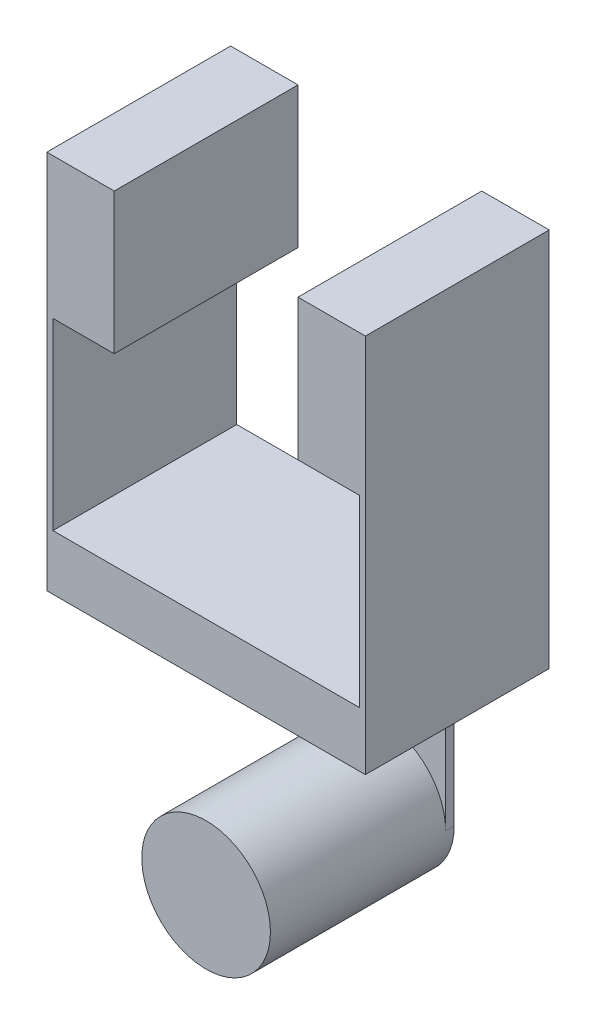
ISO-10303-21;
HEADER;
FILE_DESCRIPTION(('STEP AP214'),'2;1');
FILE_NAME('part.step','',(''),(''),'','','');
FILE_SCHEMA(('AUTOMOTIVE_DESIGN { 1 0 10303 214 1 1 1 1 }'));
ENDSEC;
DATA;
#1=APPLICATION_CONTEXT('core data for automotive mechanical design processes');
#2=APPLICATION_PROTOCOL_DEFINITION('international standard','automotive_design',2000,#1);
#3=PRODUCT_CONTEXT('',#1,'mechanical');
#4=PRODUCT('Part','Part','',(#3));
#5=PRODUCT_RELATED_PRODUCT_CATEGORY('part','',(#4));
#6=PRODUCT_DEFINITION_FORMATION('','',#4);
#7=PRODUCT_DEFINITION_CONTEXT('part definition',#1,'design');
#8=PRODUCT_DEFINITION('design','',#6,#7);
#9=PRODUCT_DEFINITION_SHAPE('','',#8);
#10=(LENGTH_UNIT() NAMED_UNIT(*) SI_UNIT(.MILLI.,.METRE.));
#11=(NAMED_UNIT(*) PLANE_ANGLE_UNIT() SI_UNIT($,.RADIAN.));
#12=(NAMED_UNIT(*) SI_UNIT($,.STERADIAN.) SOLID_ANGLE_UNIT());
#13=UNCERTAINTY_MEASURE_WITH_UNIT(LENGTH_MEASURE(1.E-05),#10,'distance_accuracy_value','');
#14=(GEOMETRIC_REPRESENTATION_CONTEXT(3) GLOBAL_UNCERTAINTY_ASSIGNED_CONTEXT((#13)) GLOBAL_UNIT_ASSIGNED_CONTEXT((#10,
#11,#12)) REPRESENTATION_CONTEXT('',''));
#15=CARTESIAN_POINT('',(0.,0.,0.));
#16=DIRECTION('',(0.,0.,1.));
#17=DIRECTION('',(1.,0.,0.));
#18=AXIS2_PLACEMENT_3D('',#15,#16,#17);
#19=CARTESIAN_POINT('',(0.,0.,-38.1));
#20=DIRECTION('',(0.,0.,1.));
#21=DIRECTION('',(1.,0.,0.));
#22=AXIS2_PLACEMENT_3D('',#19,#20,#21);
#23=CYLINDRICAL_SURFACE('',#22,13.335);
#24=DIRECTION('',(0.,0.,-1.));
#25=VECTOR('',#24,1.);
#26=CARTESIAN_POINT('',(-13.335,0.,-36.322));
#27=LINE('',#26,#25);
#28=CARTESIAN_POINT('',(-13.335,0.,-36.322));
#29=VERTEX_POINT('',#28);
#30=CARTESIAN_POINT('',(-13.335,0.,-38.1));
#31=VERTEX_POINT('',#30);
#32=EDGE_CURVE('E318',#29,#31,#27,.T.);
#33=ORIENTED_EDGE('',*,*,#32,.T.);
#34=CARTESIAN_POINT('',(0.,0.,-38.1));
#35=DIRECTION('',(0.,0.,1.));
#36=DIRECTION('',(1.,0.,0.));
#37=AXIS2_PLACEMENT_3D('',#34,#35,#36);
#38=CIRCLE('',#37,13.335);
#39=CARTESIAN_POINT('',(13.335,0.,-38.1));
#40=VERTEX_POINT('',#39);
#41=EDGE_CURVE('E52',#31,#40,#38,.T.);
#42=ORIENTED_EDGE('',*,*,#41,.T.);
#43=DIRECTION('',(0.,0.,-1.));
#44=VECTOR('',#43,1.);
#45=CARTESIAN_POINT('',(13.335,0.,-36.322));
#46=LINE('',#45,#44);
#47=CARTESIAN_POINT('',(13.335,0.,-36.322));
#48=VERTEX_POINT('',#47);
#49=EDGE_CURVE('E323',#48,#40,#46,.T.);
#50=ORIENTED_EDGE('',*,*,#49,.F.);
#51=CARTESIAN_POINT('',(0.,0.,-36.322));
#52=DIRECTION('',(0.,0.,-1.));
#53=DIRECTION('',(-1.,0.,0.));
#54=AXIS2_PLACEMENT_3D('',#51,#52,#53);
#55=CIRCLE('',#54,13.335);
#56=EDGE_CURVE('E11',#48,#29,#55,.F.);
#57=ORIENTED_EDGE('',*,*,#56,.T.);
#58=EDGE_LOOP('',(#33,#42,#50,#57));
#59=FACE_BOUND('',#58,.T.);
#60=CARTESIAN_POINT('',(0.,0.,0.));
#61=DIRECTION('',(0.,0.,1.));
#62=DIRECTION('',(1.,0.,0.));
#63=AXIS2_PLACEMENT_3D('',#60,#61,#62);
#64=CIRCLE('',#63,13.335);
#65=CARTESIAN_POINT('',(13.335,0.,0.));
#66=VERTEX_POINT('',#65);
#67=EDGE_CURVE('E325',#66,#66,#64,.T.);
#68=ORIENTED_EDGE('',*,*,#67,.F.);
#69=EDGE_LOOP('',(#68));
#70=FACE_BOUND('',#69,.T.);
#71=ADVANCED_FACE('F44',(#59,#70),#23,.T.);
#72=CARTESIAN_POINT('',(0.,0.,-38.1));
#73=DIRECTION('',(0.,0.,1.));
#74=DIRECTION('',(1.,0.,0.));
#75=AXIS2_PLACEMENT_3D('',#72,#73,#74);
#76=PLANE('',#75);
#77=ORIENTED_EDGE('',*,*,#41,.F.);
#78=DIRECTION('',(0.,1.,0.));
#79=VECTOR('',#78,1.);
#80=CARTESIAN_POINT('',(-13.335,0.,-38.1));
#81=LINE('',#80,#79);
#82=CARTESIAN_POINT('',(-13.335,38.1,-38.1));
#83=VERTEX_POINT('',#82);
#84=EDGE_CURVE('E299',#31,#83,#81,.T.);
#85=ORIENTED_EDGE('',*,*,#84,.T.);
#86=DIRECTION('',(-1.,0.,0.));
#87=VECTOR('',#86,1.);
#88=CARTESIAN_POINT('',(0.,38.1,-38.1));
#89=LINE('',#88,#87);
#90=CARTESIAN_POINT('',(-33.02,38.1,-38.1));
#91=VERTEX_POINT('',#90);
#92=EDGE_CURVE('E260',#83,#91,#89,.T.);
#93=ORIENTED_EDGE('',*,*,#92,.T.);
#94=DIRECTION('',(0.,-1.,0.));
#95=VECTOR('',#94,1.);
#96=CARTESIAN_POINT('',(-33.02,49.53,-38.1));
#97=LINE('',#96,#95);
#98=CARTESIAN_POINT('',(-33.02,116.84,-38.1));
#99=VERTEX_POINT('',#98);
#100=EDGE_CURVE('E291',#99,#91,#97,.T.);
#101=ORIENTED_EDGE('',*,*,#100,.F.);
#102=DIRECTION('',(-1.,0.,0.));
#103=VECTOR('',#102,1.);
#104=CARTESIAN_POINT('',(-33.02,116.84,-38.1));
#105=LINE('',#104,#103);
#106=CARTESIAN_POINT('',(-19.05,116.84,-38.1));
#107=VERTEX_POINT('',#106);
#108=EDGE_CURVE('E219',#107,#99,#105,.T.);
#109=ORIENTED_EDGE('',*,*,#108,.F.);
#110=DIRECTION('',(0.,-1.,0.));
#111=VECTOR('',#110,1.);
#112=CARTESIAN_POINT('',(-19.05,116.84,-38.1));
#113=LINE('',#112,#111);
#114=CARTESIAN_POINT('',(-19.05,87.63,-38.1));
#115=VERTEX_POINT('',#114);
#116=EDGE_CURVE('E216',#107,#115,#113,.T.);
#117=ORIENTED_EDGE('',*,*,#116,.T.);
#118=DIRECTION('',(-1.,0.,0.));
#119=VECTOR('',#118,1.);
#120=CARTESIAN_POINT('',(-33.02,87.63,-38.1));
#121=LINE('',#120,#119);
#122=CARTESIAN_POINT('',(-31.75,87.63,-38.1));
#123=VERTEX_POINT('',#122);
#124=EDGE_CURVE('E222',#115,#123,#121,.T.);
#125=ORIENTED_EDGE('',*,*,#124,.T.);
#126=DIRECTION('',(0.,-1.,0.));
#127=VECTOR('',#126,1.);
#128=CARTESIAN_POINT('',(-31.75,87.63,-38.1));
#129=LINE('',#128,#127);
#130=CARTESIAN_POINT('',(-31.75,49.53,-38.1));
#131=VERTEX_POINT('',#130);
#132=EDGE_CURVE('E261',#123,#131,#129,.T.);
#133=ORIENTED_EDGE('',*,*,#132,.T.);
#134=DIRECTION('',(-1.,0.,0.));
#135=VECTOR('',#134,1.);
#136=CARTESIAN_POINT('',(33.02,49.53,-38.1));
#137=LINE('',#136,#135);
#138=CARTESIAN_POINT('',(31.75,49.53,-38.1));
#139=VERTEX_POINT('',#138);
#140=EDGE_CURVE('E271',#139,#131,#137,.T.);
#141=ORIENTED_EDGE('',*,*,#140,.F.);
#142=DIRECTION('',(0.,-1.,0.));
#143=VECTOR('',#142,1.);
#144=CARTESIAN_POINT('',(31.75,87.63,-38.1));
#145=LINE('',#144,#143);
#146=CARTESIAN_POINT('',(31.75,87.63,-38.1));
#147=VERTEX_POINT('',#146);
#148=EDGE_CURVE('E251',#147,#139,#145,.T.);
#149=ORIENTED_EDGE('',*,*,#148,.F.);
#150=DIRECTION('',(-1.,0.,0.));
#151=VECTOR('',#150,1.);
#152=CARTESIAN_POINT('',(33.02,87.63,-38.1));
#153=LINE('',#152,#151);
#154=CARTESIAN_POINT('',(19.05,87.63,-38.1));
#155=VERTEX_POINT('',#154);
#156=EDGE_CURVE('E199',#147,#155,#153,.T.);
#157=ORIENTED_EDGE('',*,*,#156,.T.);
#158=DIRECTION('',(0.,-1.,0.));
#159=VECTOR('',#158,1.);
#160=CARTESIAN_POINT('',(19.05,116.84,-38.1));
#161=LINE('',#160,#159);
#162=CARTESIAN_POINT('',(19.05,116.84,-38.1));
#163=VERTEX_POINT('',#162);
#164=EDGE_CURVE('E179',#163,#155,#161,.T.);
#165=ORIENTED_EDGE('',*,*,#164,.F.);
#166=DIRECTION('',(-1.,0.,0.));
#167=VECTOR('',#166,1.);
#168=CARTESIAN_POINT('',(33.02,116.84,-38.1));
#169=LINE('',#168,#167);
#170=CARTESIAN_POINT('',(33.02,116.84,-38.1));
#171=VERTEX_POINT('',#170);
#172=EDGE_CURVE('E172',#171,#163,#169,.T.);
#173=ORIENTED_EDGE('',*,*,#172,.F.);
#174=DIRECTION('',(0.,-1.,0.));
#175=VECTOR('',#174,1.);
#176=CARTESIAN_POINT('',(33.02,49.53,-38.1));
#177=LINE('',#176,#175);
#178=CARTESIAN_POINT('',(33.02,38.1,-38.1));
#179=VERTEX_POINT('',#178);
#180=EDGE_CURVE('E158',#171,#179,#177,.T.);
#181=ORIENTED_EDGE('',*,*,#180,.T.);
#182=CARTESIAN_POINT('',(13.335,38.1,-38.1));
#183=VERTEX_POINT('',#182);
#184=EDGE_CURVE('E277',#179,#183,#89,.T.);
#185=ORIENTED_EDGE('',*,*,#184,.T.);
#186=DIRECTION('',(0.,-1.,0.));
#187=VECTOR('',#186,1.);
#188=CARTESIAN_POINT('',(13.335,38.1,-38.1));
#189=LINE('',#188,#187);
#190=EDGE_CURVE('E305',#183,#40,#189,.T.);
#191=ORIENTED_EDGE('',*,*,#190,.T.);
#192=EDGE_LOOP('',(#77,#85,#93,#101,#109,#117,#125,#133,#141,#149,#157,#165,#173,#181,#185,#191));
#193=FACE_BOUND('',#192,.T.);
#194=ADVANCED_FACE('F171',(#193),#76,.F.);
#195=CARTESIAN_POINT('',(0.,0.,0.));
#196=DIRECTION('',(0.,0.,1.));
#197=DIRECTION('',(1.,0.,0.));
#198=AXIS2_PLACEMENT_3D('',#195,#196,#197);
#199=PLANE('',#198);
#200=ORIENTED_EDGE('',*,*,#67,.T.);
#201=EDGE_LOOP('',(#200));
#202=FACE_BOUND('',#201,.T.);
#203=ADVANCED_FACE('F337',(#202),#199,.T.);
#204=CARTESIAN_POINT('',(-13.335,0.,-36.322));
#205=DIRECTION('',(-1.,0.,0.));
#206=DIRECTION('',(0.,0.,1.));
#207=AXIS2_PLACEMENT_3D('',#204,#205,#206);
#208=PLANE('',#207);
#209=ORIENTED_EDGE('',*,*,#84,.F.);
#210=ORIENTED_EDGE('',*,*,#32,.F.);
#211=DIRECTION('',(0.,1.,0.));
#212=VECTOR('',#211,1.);
#213=CARTESIAN_POINT('',(-13.335,0.,-36.322));
#214=LINE('',#213,#212);
#215=CARTESIAN_POINT('',(-13.335,38.1,-36.322));
#216=VERTEX_POINT('',#215);
#217=EDGE_CURVE('E297',#29,#216,#214,.T.);
#218=ORIENTED_EDGE('',*,*,#217,.T.);
#219=DIRECTION('',(0.,0.,-1.));
#220=VECTOR('',#219,1.);
#221=CARTESIAN_POINT('',(-13.335,38.1,-36.322));
#222=LINE('',#221,#220);
#223=EDGE_CURVE('E313',#216,#83,#222,.T.);
#224=ORIENTED_EDGE('',*,*,#223,.T.);
#225=EDGE_LOOP('',(#209,#210,#218,#224));
#226=FACE_BOUND('',#225,.T.);
#227=ADVANCED_FACE('F358',(#226),#208,.T.);
#228=CARTESIAN_POINT('',(13.335,38.1,-36.322));
#229=DIRECTION('',(1.,0.,0.));
#230=DIRECTION('',(0.,0.,-1.));
#231=AXIS2_PLACEMENT_3D('',#228,#229,#230);
#232=PLANE('',#231);
#233=ORIENTED_EDGE('',*,*,#190,.F.);
#234=DIRECTION('',(0.,0.,-1.));
#235=VECTOR('',#234,1.);
#236=CARTESIAN_POINT('',(13.335,38.1,-36.322));
#237=LINE('',#236,#235);
#238=CARTESIAN_POINT('',(13.335,38.1,-36.322));
#239=VERTEX_POINT('',#238);
#240=EDGE_CURVE('E326',#239,#183,#237,.T.);
#241=ORIENTED_EDGE('',*,*,#240,.F.);
#242=DIRECTION('',(0.,-1.,0.));
#243=VECTOR('',#242,1.);
#244=CARTESIAN_POINT('',(13.335,38.1,-36.322));
#245=LINE('',#244,#243);
#246=EDGE_CURVE('E307',#239,#48,#245,.T.);
#247=ORIENTED_EDGE('',*,*,#246,.T.);
#248=ORIENTED_EDGE('',*,*,#49,.T.);
#249=EDGE_LOOP('',(#233,#241,#247,#248));
#250=FACE_BOUND('',#249,.T.);
#251=ADVANCED_FACE('F352',(#250),#232,.T.);
#252=CARTESIAN_POINT('',(0.,0.,-36.322));
#253=DIRECTION('',(0.,0.,-1.));
#254=DIRECTION('',(-1.,0.,0.));
#255=AXIS2_PLACEMENT_3D('',#252,#253,#254);
#256=PLANE('',#255);
#257=ORIENTED_EDGE('',*,*,#56,.F.);
#258=ORIENTED_EDGE('',*,*,#246,.F.);
#259=DIRECTION('',(1.,0.,0.));
#260=VECTOR('',#259,1.);
#261=CARTESIAN_POINT('',(-13.335,38.1,-36.322));
#262=LINE('',#261,#260);
#263=EDGE_CURVE('E304',#216,#239,#262,.T.);
#264=ORIENTED_EDGE('',*,*,#263,.F.);
#265=ORIENTED_EDGE('',*,*,#217,.F.);
#266=EDGE_LOOP('',(#257,#258,#264,#265));
#267=FACE_BOUND('',#266,.T.);
#268=ADVANCED_FACE('F356',(#267),#256,.F.);
#269=CARTESIAN_POINT('',(-33.02,49.53,-38.1));
#270=DIRECTION('',(1.,0.,0.));
#271=DIRECTION('',(0.,0.,-1.));
#272=AXIS2_PLACEMENT_3D('',#269,#270,#271);
#273=PLANE('',#272);
#274=DIRECTION('',(0.,0.,1.));
#275=VECTOR('',#274,1.);
#276=CARTESIAN_POINT('',(-33.02,38.1,-38.1));
#277=LINE('',#276,#275);
#278=CARTESIAN_POINT('',(-33.02,38.1,0.));
#279=VERTEX_POINT('',#278);
#280=EDGE_CURVE('E276',#91,#279,#277,.T.);
#281=ORIENTED_EDGE('',*,*,#280,.T.);
#282=DIRECTION('',(0.,-1.,0.));
#283=VECTOR('',#282,1.);
#284=CARTESIAN_POINT('',(-33.02,49.53,0.));
#285=LINE('',#284,#283);
#286=CARTESIAN_POINT('',(-33.02,116.84,0.));
#287=VERTEX_POINT('',#286);
#288=EDGE_CURVE('E286',#287,#279,#285,.T.);
#289=ORIENTED_EDGE('',*,*,#288,.F.);
#290=DIRECTION('',(0.,0.,1.));
#291=VECTOR('',#290,1.);
#292=CARTESIAN_POINT('',(-33.02,116.84,0.));
#293=LINE('',#292,#291);
#294=EDGE_CURVE('E228',#99,#287,#293,.T.);
#295=ORIENTED_EDGE('',*,*,#294,.F.);
#296=ORIENTED_EDGE('',*,*,#100,.T.);
#297=EDGE_LOOP('',(#281,#289,#295,#296));
#298=FACE_BOUND('',#297,.T.);
#299=ADVANCED_FACE('F369',(#298),#273,.F.);
#300=CARTESIAN_POINT('',(-33.02,49.53,0.));
#301=DIRECTION('',(0.,0.,-1.));
#302=DIRECTION('',(-1.,0.,0.));
#303=AXIS2_PLACEMENT_3D('',#300,#301,#302);
#304=PLANE('',#303);
#305=DIRECTION('',(1.,0.,0.));
#306=VECTOR('',#305,1.);
#307=CARTESIAN_POINT('',(-33.02,38.1,0.));
#308=LINE('',#307,#306);
#309=CARTESIAN_POINT('',(33.02,38.1,0.));
#310=VERTEX_POINT('',#309);
#311=EDGE_CURVE('E284',#279,#310,#308,.T.);
#312=ORIENTED_EDGE('',*,*,#311,.T.);
#313=DIRECTION('',(0.,-1.,0.));
#314=VECTOR('',#313,1.);
#315=CARTESIAN_POINT('',(33.02,49.53,0.));
#316=LINE('',#315,#314);
#317=CARTESIAN_POINT('',(33.02,116.84,0.));
#318=VERTEX_POINT('',#317);
#319=EDGE_CURVE('E166',#318,#310,#316,.T.);
#320=ORIENTED_EDGE('',*,*,#319,.F.);
#321=DIRECTION('',(1.,0.,0.));
#322=VECTOR('',#321,1.);
#323=CARTESIAN_POINT('',(33.02,116.84,0.));
#324=LINE('',#323,#322);
#325=CARTESIAN_POINT('',(19.05,116.84,0.));
#326=VERTEX_POINT('',#325);
#327=EDGE_CURVE('E188',#326,#318,#324,.T.);
#328=ORIENTED_EDGE('',*,*,#327,.F.);
#329=DIRECTION('',(0.,-1.,0.));
#330=VECTOR('',#329,1.);
#331=CARTESIAN_POINT('',(19.05,116.84,0.));
#332=LINE('',#331,#330);
#333=CARTESIAN_POINT('',(19.05,87.63,0.));
#334=VERTEX_POINT('',#333);
#335=EDGE_CURVE('E200',#326,#334,#332,.T.);
#336=ORIENTED_EDGE('',*,*,#335,.T.);
#337=DIRECTION('',(1.,0.,0.));
#338=VECTOR('',#337,1.);
#339=CARTESIAN_POINT('',(33.02,87.63,0.));
#340=LINE('',#339,#338);
#341=CARTESIAN_POINT('',(31.75,87.63,0.));
#342=VERTEX_POINT('',#341);
#343=EDGE_CURVE('E187',#334,#342,#340,.T.);
#344=ORIENTED_EDGE('',*,*,#343,.T.);
#345=DIRECTION('',(0.,-1.,0.));
#346=VECTOR('',#345,1.);
#347=CARTESIAN_POINT('',(31.75,87.63,0.));
#348=LINE('',#347,#346);
#349=CARTESIAN_POINT('',(31.75,49.53,0.));
#350=VERTEX_POINT('',#349);
#351=EDGE_CURVE('E249',#342,#350,#348,.T.);
#352=ORIENTED_EDGE('',*,*,#351,.T.);
#353=DIRECTION('',(1.,0.,0.));
#354=VECTOR('',#353,1.);
#355=CARTESIAN_POINT('',(-33.02,49.53,0.));
#356=LINE('',#355,#354);
#357=CARTESIAN_POINT('',(-31.75,49.53,0.));
#358=VERTEX_POINT('',#357);
#359=EDGE_CURVE('E168',#358,#350,#356,.T.);
#360=ORIENTED_EDGE('',*,*,#359,.F.);
#361=DIRECTION('',(0.,-1.,0.));
#362=VECTOR('',#361,1.);
#363=CARTESIAN_POINT('',(-31.75,87.63,0.));
#364=LINE('',#363,#362);
#365=CARTESIAN_POINT('',(-31.75,87.63,0.));
#366=VERTEX_POINT('',#365);
#367=EDGE_CURVE('E211',#366,#358,#364,.T.);
#368=ORIENTED_EDGE('',*,*,#367,.F.);
#369=DIRECTION('',(1.,0.,0.));
#370=VECTOR('',#369,1.);
#371=CARTESIAN_POINT('',(-33.02,87.63,0.));
#372=LINE('',#371,#370);
#373=CARTESIAN_POINT('',(-19.05,87.63,0.));
#374=VERTEX_POINT('',#373);
#375=EDGE_CURVE('E201',#366,#374,#372,.T.);
#376=ORIENTED_EDGE('',*,*,#375,.T.);
#377=DIRECTION('',(0.,-1.,0.));
#378=VECTOR('',#377,1.);
#379=CARTESIAN_POINT('',(-19.05,116.84,0.));
#380=LINE('',#379,#378);
#381=CARTESIAN_POINT('',(-19.05,116.84,0.));
#382=VERTEX_POINT('',#381);
#383=EDGE_CURVE('E215',#382,#374,#380,.T.);
#384=ORIENTED_EDGE('',*,*,#383,.F.);
#385=DIRECTION('',(1.,0.,0.));
#386=VECTOR('',#385,1.);
#387=CARTESIAN_POINT('',(-33.02,116.84,0.));
#388=LINE('',#387,#386);
#389=EDGE_CURVE('E240',#287,#382,#388,.T.);
#390=ORIENTED_EDGE('',*,*,#389,.F.);
#391=ORIENTED_EDGE('',*,*,#288,.T.);
#392=EDGE_LOOP('',(#312,#320,#328,#336,#344,#352,#360,#368,#376,#384,#390,#391));
#393=FACE_BOUND('',#392,.T.);
#394=ADVANCED_FACE('F375',(#393),#304,.F.);
#395=CARTESIAN_POINT('',(33.02,49.53,0.));
#396=DIRECTION('',(-1.,0.,0.));
#397=DIRECTION('',(0.,0.,1.));
#398=AXIS2_PLACEMENT_3D('',#395,#396,#397);
#399=PLANE('',#398);
#400=DIRECTION('',(0.,0.,-1.));
#401=VECTOR('',#400,1.);
#402=CARTESIAN_POINT('',(33.02,38.1,0.));
#403=LINE('',#402,#401);
#404=EDGE_CURVE('E164',#310,#179,#403,.T.);
#405=ORIENTED_EDGE('',*,*,#404,.T.);
#406=ORIENTED_EDGE('',*,*,#180,.F.);
#407=DIRECTION('',(0.,0.,-1.));
#408=VECTOR('',#407,1.);
#409=CARTESIAN_POINT('',(33.02,116.84,0.));
#410=LINE('',#409,#408);
#411=EDGE_CURVE('E162',#318,#171,#410,.T.);
#412=ORIENTED_EDGE('',*,*,#411,.F.);
#413=ORIENTED_EDGE('',*,*,#319,.T.);
#414=EDGE_LOOP('',(#405,#406,#412,#413));
#415=FACE_BOUND('',#414,.T.);
#416=ADVANCED_FACE('F159',(#415),#399,.F.);
#417=CARTESIAN_POINT('',(0.,49.53,0.));
#418=DIRECTION('',(0.,1.,0.));
#419=DIRECTION('',(0.,0.,1.));
#420=AXIS2_PLACEMENT_3D('',#417,#418,#419);
#421=PLANE('',#420);
#422=DIRECTION('',(0.,0.,1.));
#423=VECTOR('',#422,1.);
#424=CARTESIAN_POINT('',(31.75,49.53,0.));
#425=LINE('',#424,#423);
#426=EDGE_CURVE('E61',#139,#350,#425,.T.);
#427=ORIENTED_EDGE('',*,*,#426,.F.);
#428=ORIENTED_EDGE('',*,*,#140,.T.);
#429=DIRECTION('',(0.,0.,-1.));
#430=VECTOR('',#429,1.);
#431=CARTESIAN_POINT('',(-31.75,49.53,0.));
#432=LINE('',#431,#430);
#433=EDGE_CURVE('E58',#358,#131,#432,.T.);
#434=ORIENTED_EDGE('',*,*,#433,.F.);
#435=ORIENTED_EDGE('',*,*,#359,.T.);
#436=EDGE_LOOP('',(#427,#428,#434,#435));
#437=FACE_BOUND('',#436,.T.);
#438=ADVANCED_FACE('F377',(#437),#421,.T.);
#439=CARTESIAN_POINT('',(0.,38.1,0.));
#440=DIRECTION('',(0.,1.,0.));
#441=DIRECTION('',(0.,0.,1.));
#442=AXIS2_PLACEMENT_3D('',#439,#440,#441);
#443=PLANE('',#442);
#444=ORIENTED_EDGE('',*,*,#223,.F.);
#445=ORIENTED_EDGE('',*,*,#263,.T.);
#446=ORIENTED_EDGE('',*,*,#240,.T.);
#447=ORIENTED_EDGE('',*,*,#184,.F.);
#448=ORIENTED_EDGE('',*,*,#404,.F.);
#449=ORIENTED_EDGE('',*,*,#311,.F.);
#450=ORIENTED_EDGE('',*,*,#280,.F.);
#451=ORIENTED_EDGE('',*,*,#92,.F.);
#452=EDGE_LOOP('',(#444,#445,#446,#447,#448,#449,#450,#451));
#453=FACE_BOUND('',#452,.T.);
#454=ADVANCED_FACE('F359',(#453),#443,.F.);
#455=CARTESIAN_POINT('',(-31.75,87.63,0.));
#456=DIRECTION('',(-1.,0.,0.));
#457=DIRECTION('',(0.,0.,1.));
#458=AXIS2_PLACEMENT_3D('',#455,#456,#457);
#459=PLANE('',#458);
#460=ORIENTED_EDGE('',*,*,#433,.T.);
#461=ORIENTED_EDGE('',*,*,#132,.F.);
#462=DIRECTION('',(0.,0.,-1.));
#463=VECTOR('',#462,1.);
#464=CARTESIAN_POINT('',(-31.75,87.63,0.));
#465=LINE('',#464,#463);
#466=EDGE_CURVE('E264',#366,#123,#465,.T.);
#467=ORIENTED_EDGE('',*,*,#466,.F.);
#468=ORIENTED_EDGE('',*,*,#367,.T.);
#469=EDGE_LOOP('',(#460,#461,#467,#468));
#470=FACE_BOUND('',#469,.T.);
#471=ADVANCED_FACE('F385',(#470),#459,.F.);
#472=CARTESIAN_POINT('',(31.75,87.63,0.));
#473=DIRECTION('',(1.,0.,0.));
#474=DIRECTION('',(0.,0.,-1.));
#475=AXIS2_PLACEMENT_3D('',#472,#473,#474);
#476=PLANE('',#475);
#477=ORIENTED_EDGE('',*,*,#426,.T.);
#478=ORIENTED_EDGE('',*,*,#351,.F.);
#479=DIRECTION('',(0.,0.,1.));
#480=VECTOR('',#479,1.);
#481=CARTESIAN_POINT('',(31.75,87.63,0.));
#482=LINE('',#481,#480);
#483=EDGE_CURVE('E242',#147,#342,#482,.T.);
#484=ORIENTED_EDGE('',*,*,#483,.F.);
#485=ORIENTED_EDGE('',*,*,#148,.T.);
#486=EDGE_LOOP('',(#477,#478,#484,#485));
#487=FACE_BOUND('',#486,.T.);
#488=ADVANCED_FACE('F390',(#487),#476,.F.);
#489=CARTESIAN_POINT('',(0.,87.63,0.));
#490=DIRECTION('',(0.,1.,0.));
#491=DIRECTION('',(0.,0.,1.));
#492=AXIS2_PLACEMENT_3D('',#489,#490,#491);
#493=PLANE('',#492);
#494=ORIENTED_EDGE('',*,*,#156,.F.);
#495=ORIENTED_EDGE('',*,*,#483,.T.);
#496=ORIENTED_EDGE('',*,*,#343,.F.);
#497=DIRECTION('',(0.,0.,1.));
#498=VECTOR('',#497,1.);
#499=CARTESIAN_POINT('',(19.05,87.63,0.));
#500=LINE('',#499,#498);
#501=EDGE_CURVE('E194',#155,#334,#500,.T.);
#502=ORIENTED_EDGE('',*,*,#501,.F.);
#503=EDGE_LOOP('',(#494,#495,#496,#502));
#504=FACE_BOUND('',#503,.T.);
#505=ADVANCED_FACE('F393',(#504),#493,.F.);
#506=CARTESIAN_POINT('',(19.05,116.84,0.));
#507=DIRECTION('',(1.,0.,0.));
#508=DIRECTION('',(0.,0.,-1.));
#509=AXIS2_PLACEMENT_3D('',#506,#507,#508);
#510=PLANE('',#509);
#511=ORIENTED_EDGE('',*,*,#501,.T.);
#512=ORIENTED_EDGE('',*,*,#335,.F.);
#513=DIRECTION('',(0.,0.,1.));
#514=VECTOR('',#513,1.);
#515=CARTESIAN_POINT('',(19.05,116.84,0.));
#516=LINE('',#515,#514);
#517=EDGE_CURVE('E182',#163,#326,#516,.T.);
#518=ORIENTED_EDGE('',*,*,#517,.F.);
#519=ORIENTED_EDGE('',*,*,#164,.T.);
#520=EDGE_LOOP('',(#511,#512,#518,#519));
#521=FACE_BOUND('',#520,.T.);
#522=ADVANCED_FACE('F403',(#521),#510,.F.);
#523=CARTESIAN_POINT('',(0.,116.84,0.));
#524=DIRECTION('',(0.,1.,0.));
#525=DIRECTION('',(0.,0.,1.));
#526=AXIS2_PLACEMENT_3D('',#523,#524,#525);
#527=PLANE('',#526);
#528=ORIENTED_EDGE('',*,*,#411,.T.);
#529=ORIENTED_EDGE('',*,*,#172,.T.);
#530=ORIENTED_EDGE('',*,*,#517,.T.);
#531=ORIENTED_EDGE('',*,*,#327,.T.);
#532=EDGE_LOOP('',(#528,#529,#530,#531));
#533=FACE_BOUND('',#532,.T.);
#534=ADVANCED_FACE('F184',(#533),#527,.T.);
#535=CARTESIAN_POINT('',(-19.05,116.84,0.));
#536=DIRECTION('',(-1.,0.,0.));
#537=DIRECTION('',(0.,0.,1.));
#538=AXIS2_PLACEMENT_3D('',#535,#536,#537);
#539=PLANE('',#538);
#540=DIRECTION('',(0.,0.,-1.));
#541=VECTOR('',#540,1.);
#542=CARTESIAN_POINT('',(-19.05,87.63,0.));
#543=LINE('',#542,#541);
#544=EDGE_CURVE('E223',#374,#115,#543,.T.);
#545=ORIENTED_EDGE('',*,*,#544,.T.);
#546=ORIENTED_EDGE('',*,*,#116,.F.);
#547=DIRECTION('',(0.,0.,-1.));
#548=VECTOR('',#547,1.);
#549=CARTESIAN_POINT('',(-19.05,116.84,0.));
#550=LINE('',#549,#548);
#551=EDGE_CURVE('E231',#382,#107,#550,.T.);
#552=ORIENTED_EDGE('',*,*,#551,.F.);
#553=ORIENTED_EDGE('',*,*,#383,.T.);
#554=EDGE_LOOP('',(#545,#546,#552,#553));
#555=FACE_BOUND('',#554,.T.);
#556=ADVANCED_FACE('F399',(#555),#539,.F.);
#557=CARTESIAN_POINT('',(0.,116.84,0.));
#558=DIRECTION('',(0.,-1.,0.));
#559=DIRECTION('',(0.,0.,-1.));
#560=AXIS2_PLACEMENT_3D('',#557,#558,#559);
#561=PLANE('',#560);
#562=ORIENTED_EDGE('',*,*,#294,.T.);
#563=ORIENTED_EDGE('',*,*,#389,.T.);
#564=ORIENTED_EDGE('',*,*,#551,.T.);
#565=ORIENTED_EDGE('',*,*,#108,.T.);
#566=EDGE_LOOP('',(#562,#563,#564,#565));
#567=FACE_BOUND('',#566,.T.);
#568=ADVANCED_FACE('F392',(#567),#561,.F.);
#569=CARTESIAN_POINT('',(0.,87.63,0.));
#570=DIRECTION('',(0.,-1.,0.));
#571=DIRECTION('',(0.,0.,-1.));
#572=AXIS2_PLACEMENT_3D('',#569,#570,#571);
#573=PLANE('',#572);
#574=ORIENTED_EDGE('',*,*,#375,.F.);
#575=ORIENTED_EDGE('',*,*,#466,.T.);
#576=ORIENTED_EDGE('',*,*,#124,.F.);
#577=ORIENTED_EDGE('',*,*,#544,.F.);
#578=EDGE_LOOP('',(#574,#575,#576,#577));
#579=FACE_BOUND('',#578,.T.);
#580=ADVANCED_FACE('F397',(#579),#573,.T.);
#581=CLOSED_SHELL('',(#71,#194,#203,#227,#251,#268,#299,#394,#416,#438,#454,#471,#488,#505,#522,
#534,#556,#568,#580));
#582=MANIFOLD_SOLID_BREP('B2',#581);
#583=ADVANCED_BREP_SHAPE_REPRESENTATION('',(#18,#582),#14);
#584=SHAPE_DEFINITION_REPRESENTATION(#9,#583);
ENDSEC;
END-ISO-10303-21;
